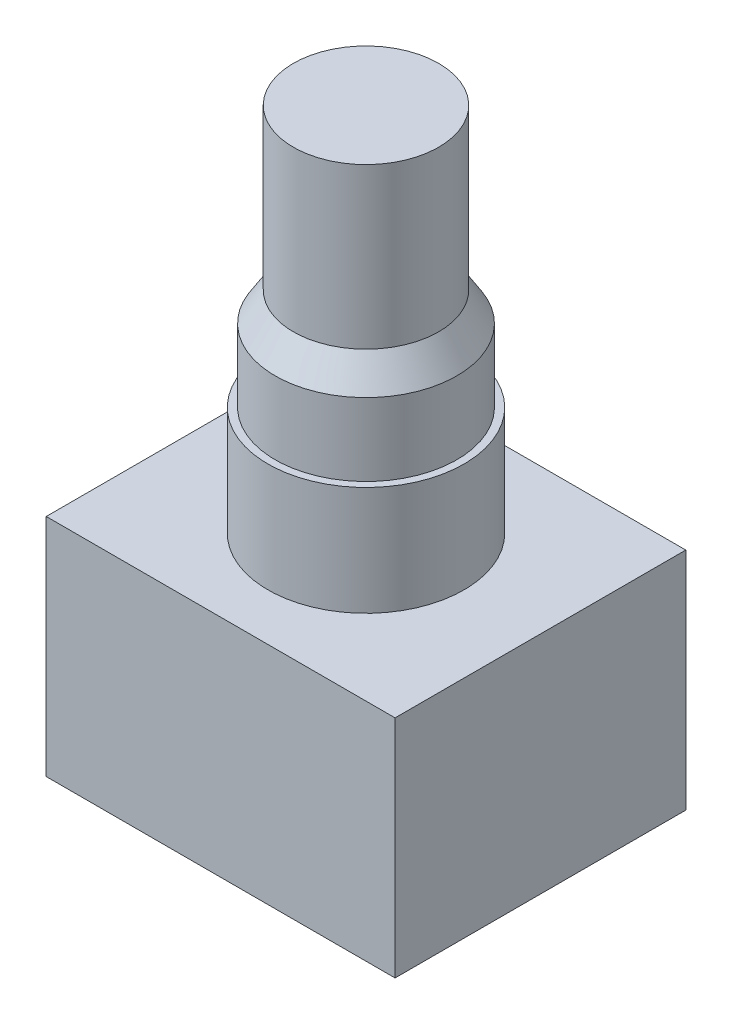
ISO-10303-21;
HEADER;
FILE_DESCRIPTION(('STEP AP214'),'2;1');
FILE_NAME('part.step','',(''),(''),'','','');
FILE_SCHEMA(('AUTOMOTIVE_DESIGN { 1 0 10303 214 1 1 1 1 }'));
ENDSEC;
DATA;
#1=APPLICATION_CONTEXT('core data for automotive mechanical design processes');
#2=APPLICATION_PROTOCOL_DEFINITION('international standard','automotive_design',2000,#1);
#3=PRODUCT_CONTEXT('',#1,'mechanical');
#4=PRODUCT('Part','Part','',(#3));
#5=PRODUCT_RELATED_PRODUCT_CATEGORY('part','',(#4));
#6=PRODUCT_DEFINITION_FORMATION('','',#4);
#7=PRODUCT_DEFINITION_CONTEXT('part definition',#1,'design');
#8=PRODUCT_DEFINITION('design','',#6,#7);
#9=PRODUCT_DEFINITION_SHAPE('','',#8);
#10=(LENGTH_UNIT() NAMED_UNIT(*) SI_UNIT(.MILLI.,.METRE.));
#11=(NAMED_UNIT(*) PLANE_ANGLE_UNIT() SI_UNIT($,.RADIAN.));
#12=(NAMED_UNIT(*) SI_UNIT($,.STERADIAN.) SOLID_ANGLE_UNIT());
#13=UNCERTAINTY_MEASURE_WITH_UNIT(LENGTH_MEASURE(1.E-05),#10,'distance_accuracy_value','');
#14=(GEOMETRIC_REPRESENTATION_CONTEXT(3) GLOBAL_UNCERTAINTY_ASSIGNED_CONTEXT((#13)) GLOBAL_UNIT_ASSIGNED_CONTEXT((#10,
#11,#12)) REPRESENTATION_CONTEXT('',''));
#15=CARTESIAN_POINT('',(0.,0.,0.));
#16=DIRECTION('',(0.,0.,1.));
#17=DIRECTION('',(1.,0.,0.));
#18=AXIS2_PLACEMENT_3D('',#15,#16,#17);
#19=CARTESIAN_POINT('',(-6.096,-7.874,5.08));
#20=DIRECTION('',(-1.,0.,0.));
#21=DIRECTION('',(0.,0.,1.));
#22=AXIS2_PLACEMENT_3D('',#19,#20,#21);
#23=PLANE('',#22);
#24=DIRECTION('',(0.,0.,1.));
#25=VECTOR('',#24,1.);
#26=CARTESIAN_POINT('',(-6.096,0.,5.08));
#27=LINE('',#26,#25);
#28=CARTESIAN_POINT('',(-6.096,0.,-5.08));
#29=VERTEX_POINT('',#28);
#30=CARTESIAN_POINT('',(-6.096,0.,5.08));
#31=VERTEX_POINT('',#30);
#32=EDGE_CURVE('E112',#29,#31,#27,.T.);
#33=ORIENTED_EDGE('',*,*,#32,.F.);
#34=DIRECTION('',(0.,1.,0.));
#35=VECTOR('',#34,1.);
#36=CARTESIAN_POINT('',(-6.096,-7.874,-5.08));
#37=LINE('',#36,#35);
#38=CARTESIAN_POINT('',(-6.096,-7.874,-5.08));
#39=VERTEX_POINT('',#38);
#40=EDGE_CURVE('E11',#39,#29,#37,.T.);
#41=ORIENTED_EDGE('',*,*,#40,.F.);
#42=DIRECTION('',(0.,0.,1.));
#43=VECTOR('',#42,1.);
#44=CARTESIAN_POINT('',(-6.096,-7.874,5.08));
#45=LINE('',#44,#43);
#46=CARTESIAN_POINT('',(-6.096,-7.874,5.08));
#47=VERTEX_POINT('',#46);
#48=EDGE_CURVE('E103',#39,#47,#45,.T.);
#49=ORIENTED_EDGE('',*,*,#48,.T.);
#50=DIRECTION('',(0.,1.,0.));
#51=VECTOR('',#50,1.);
#52=CARTESIAN_POINT('',(-6.096,-7.874,5.08));
#53=LINE('',#52,#51);
#54=EDGE_CURVE('E44',#47,#31,#53,.T.);
#55=ORIENTED_EDGE('',*,*,#54,.T.);
#56=EDGE_LOOP('',(#33,#41,#49,#55));
#57=FACE_BOUND('',#56,.T.);
#58=ADVANCED_FACE('F41',(#57),#23,.T.);
#59=CARTESIAN_POINT('',(6.096,-7.874,-5.08));
#60=DIRECTION('',(0.,0.,-1.));
#61=DIRECTION('',(-1.,0.,0.));
#62=AXIS2_PLACEMENT_3D('',#59,#60,#61);
#63=PLANE('',#62);
#64=DIRECTION('',(-1.,0.,0.));
#65=VECTOR('',#64,1.);
#66=CARTESIAN_POINT('',(6.096,0.,-5.08));
#67=LINE('',#66,#65);
#68=CARTESIAN_POINT('',(6.096,0.,-5.08));
#69=VERTEX_POINT('',#68);
#70=EDGE_CURVE('E106',#69,#29,#67,.T.);
#71=ORIENTED_EDGE('',*,*,#70,.F.);
#72=DIRECTION('',(0.,1.,0.));
#73=VECTOR('',#72,1.);
#74=CARTESIAN_POINT('',(6.096,-7.874,-5.08));
#75=LINE('',#74,#73);
#76=CARTESIAN_POINT('',(6.096,-7.874,-5.08));
#77=VERTEX_POINT('',#76);
#78=EDGE_CURVE('E51',#77,#69,#75,.T.);
#79=ORIENTED_EDGE('',*,*,#78,.F.);
#80=DIRECTION('',(-1.,0.,0.));
#81=VECTOR('',#80,1.);
#82=CARTESIAN_POINT('',(6.096,-7.874,-5.08));
#83=LINE('',#82,#81);
#84=EDGE_CURVE('E98',#77,#39,#83,.T.);
#85=ORIENTED_EDGE('',*,*,#84,.T.);
#86=ORIENTED_EDGE('',*,*,#40,.T.);
#87=EDGE_LOOP('',(#71,#79,#85,#86));
#88=FACE_BOUND('',#87,.T.);
#89=ADVANCED_FACE('F129',(#88),#63,.T.);
#90=CARTESIAN_POINT('',(6.096,-7.874,5.08));
#91=DIRECTION('',(1.,0.,0.));
#92=DIRECTION('',(0.,0.,-1.));
#93=AXIS2_PLACEMENT_3D('',#90,#91,#92);
#94=PLANE('',#93);
#95=DIRECTION('',(0.,0.,-1.));
#96=VECTOR('',#95,1.);
#97=CARTESIAN_POINT('',(6.096,0.,5.08));
#98=LINE('',#97,#96);
#99=CARTESIAN_POINT('',(6.096,0.,5.08));
#100=VERTEX_POINT('',#99);
#101=EDGE_CURVE('E92',#100,#69,#98,.T.);
#102=ORIENTED_EDGE('',*,*,#101,.F.);
#103=DIRECTION('',(0.,1.,0.));
#104=VECTOR('',#103,1.);
#105=CARTESIAN_POINT('',(6.096,-7.874,5.08));
#106=LINE('',#105,#104);
#107=CARTESIAN_POINT('',(6.096,-7.874,5.08));
#108=VERTEX_POINT('',#107);
#109=EDGE_CURVE('E87',#108,#100,#106,.T.);
#110=ORIENTED_EDGE('',*,*,#109,.F.);
#111=DIRECTION('',(0.,0.,-1.));
#112=VECTOR('',#111,1.);
#113=CARTESIAN_POINT('',(6.096,-7.874,5.08));
#114=LINE('',#113,#112);
#115=EDGE_CURVE('E90',#108,#77,#114,.T.);
#116=ORIENTED_EDGE('',*,*,#115,.T.);
#117=ORIENTED_EDGE('',*,*,#78,.T.);
#118=EDGE_LOOP('',(#102,#110,#116,#117));
#119=FACE_BOUND('',#118,.T.);
#120=ADVANCED_FACE('F89',(#119),#94,.T.);
#121=CARTESIAN_POINT('',(6.096,-7.874,5.08));
#122=DIRECTION('',(0.,0.,1.));
#123=DIRECTION('',(1.,0.,0.));
#124=AXIS2_PLACEMENT_3D('',#121,#122,#123);
#125=PLANE('',#124);
#126=DIRECTION('',(1.,0.,0.));
#127=VECTOR('',#126,1.);
#128=CARTESIAN_POINT('',(6.096,0.,5.08));
#129=LINE('',#128,#127);
#130=EDGE_CURVE('E116',#31,#100,#129,.T.);
#131=ORIENTED_EDGE('',*,*,#130,.F.);
#132=ORIENTED_EDGE('',*,*,#54,.F.);
#133=DIRECTION('',(1.,0.,0.));
#134=VECTOR('',#133,1.);
#135=CARTESIAN_POINT('',(6.096,-7.874,5.08));
#136=LINE('',#135,#134);
#137=EDGE_CURVE('E97',#47,#108,#136,.T.);
#138=ORIENTED_EDGE('',*,*,#137,.T.);
#139=ORIENTED_EDGE('',*,*,#109,.T.);
#140=EDGE_LOOP('',(#131,#132,#138,#139));
#141=FACE_BOUND('',#140,.T.);
#142=ADVANCED_FACE('F101',(#141),#125,.T.);
#143=CARTESIAN_POINT('',(0.,-7.874,0.));
#144=DIRECTION('',(0.,1.,0.));
#145=DIRECTION('',(0.,0.,1.));
#146=AXIS2_PLACEMENT_3D('',#143,#144,#145);
#147=PLANE('',#146);
#148=ORIENTED_EDGE('',*,*,#48,.F.);
#149=ORIENTED_EDGE('',*,*,#84,.F.);
#150=ORIENTED_EDGE('',*,*,#115,.F.);
#151=ORIENTED_EDGE('',*,*,#137,.F.);
#152=EDGE_LOOP('',(#148,#149,#150,#151));
#153=FACE_BOUND('',#152,.T.);
#154=ADVANCED_FACE('F96',(#153),#147,.F.);
#155=CARTESIAN_POINT('',(0.,0.,0.));
#156=DIRECTION('',(0.,1.,0.));
#157=DIRECTION('',(0.,0.,1.));
#158=AXIS2_PLACEMENT_3D('',#155,#156,#157);
#159=PLANE('',#158);
#160=CARTESIAN_POINT('',(0.,0.,0.));
#161=DIRECTION('',(0.,-1.,0.));
#162=DIRECTION('',(0.,0.,-1.));
#163=AXIS2_PLACEMENT_3D('',#160,#161,#162);
#164=CIRCLE('',#163,3.429);
#165=CARTESIAN_POINT('',(0.,0.,-3.429));
#166=VERTEX_POINT('',#165);
#167=EDGE_CURVE('E117',#166,#166,#164,.T.);
#168=ORIENTED_EDGE('',*,*,#167,.T.);
#169=EDGE_LOOP('',(#168));
#170=FACE_BOUND('',#169,.T.);
#171=ORIENTED_EDGE('',*,*,#32,.T.);
#172=ORIENTED_EDGE('',*,*,#130,.T.);
#173=ORIENTED_EDGE('',*,*,#101,.T.);
#174=ORIENTED_EDGE('',*,*,#70,.T.);
#175=EDGE_LOOP('',(#171,#172,#173,#174));
#176=FACE_BOUND('',#175,.T.);
#177=ADVANCED_FACE('F128',(#170,#176),#159,.T.);
#178=CARTESIAN_POINT('',(0.,0.,0.));
#179=DIRECTION('',(0.,-1.,0.));
#180=DIRECTION('',(0.,0.,-1.));
#181=AXIS2_PLACEMENT_3D('',#178,#179,#180);
#182=CYLINDRICAL_SURFACE('',#181,3.429);
#183=CARTESIAN_POINT('',(0.,3.81,0.));
#184=DIRECTION('',(0.,-1.,0.));
#185=DIRECTION('',(0.,0.,-1.));
#186=AXIS2_PLACEMENT_3D('',#183,#184,#185);
#187=CIRCLE('',#186,3.429);
#188=CARTESIAN_POINT('',(0.,3.81,-3.429));
#189=VERTEX_POINT('',#188);
#190=EDGE_CURVE('E191',#189,#189,#187,.T.);
#191=ORIENTED_EDGE('',*,*,#190,.T.);
#192=EDGE_LOOP('',(#191));
#193=FACE_BOUND('',#192,.T.);
#194=ORIENTED_EDGE('',*,*,#167,.F.);
#195=EDGE_LOOP('',(#194));
#196=FACE_BOUND('',#195,.T.);
#197=ADVANCED_FACE('F146',(#193,#196),#182,.T.);
#198=CARTESIAN_POINT('',(0.,3.81,-3.429));
#199=DIRECTION('',(0.,1.,0.));
#200=DIRECTION('',(0.,0.,1.));
#201=AXIS2_PLACEMENT_3D('',#198,#199,#200);
#202=PLANE('',#201);
#203=CARTESIAN_POINT('',(0.,3.81,0.));
#204=DIRECTION('',(0.,-1.,0.));
#205=DIRECTION('',(0.,0.,-1.));
#206=AXIS2_PLACEMENT_3D('',#203,#204,#205);
#207=CIRCLE('',#206,3.175);
#208=CARTESIAN_POINT('',(0.,3.81,-3.175));
#209=VERTEX_POINT('',#208);
#210=EDGE_CURVE('E187',#209,#209,#207,.T.);
#211=ORIENTED_EDGE('',*,*,#210,.T.);
#212=EDGE_LOOP('',(#211));
#213=FACE_BOUND('',#212,.T.);
#214=ORIENTED_EDGE('',*,*,#190,.F.);
#215=EDGE_LOOP('',(#214));
#216=FACE_BOUND('',#215,.T.);
#217=ADVANCED_FACE('F151',(#213,#216),#202,.T.);
#218=CARTESIAN_POINT('',(0.,0.,0.));
#219=DIRECTION('',(0.,-1.,0.));
#220=DIRECTION('',(0.,0.,-1.));
#221=AXIS2_PLACEMENT_3D('',#218,#219,#220);
#222=CYLINDRICAL_SURFACE('',#221,3.175);
#223=CARTESIAN_POINT('',(0.,6.35,0.));
#224=DIRECTION('',(0.,-1.,0.));
#225=DIRECTION('',(0.,0.,-1.));
#226=AXIS2_PLACEMENT_3D('',#223,#224,#225);
#227=CIRCLE('',#226,3.175);
#228=CARTESIAN_POINT('',(0.,6.35,-3.175));
#229=VERTEX_POINT('',#228);
#230=EDGE_CURVE('E181',#229,#229,#227,.T.);
#231=ORIENTED_EDGE('',*,*,#230,.T.);
#232=EDGE_LOOP('',(#231));
#233=FACE_BOUND('',#232,.T.);
#234=ORIENTED_EDGE('',*,*,#210,.F.);
#235=EDGE_LOOP('',(#234));
#236=FACE_BOUND('',#235,.T.);
#237=ADVANCED_FACE('F155',(#233,#236),#222,.T.);
#238=CARTESIAN_POINT('',(0.,6.35,0.));
#239=DIRECTION('',(0.,-1.,0.));
#240=DIRECTION('',(0.,0.,-1.));
#241=AXIS2_PLACEMENT_3D('',#238,#239,#240);
#242=CONICAL_SURFACE('',#241,3.175,0.558599315343562);
#243=CARTESIAN_POINT('',(0.,7.366,0.));
#244=DIRECTION('',(0.,-1.,0.));
#245=DIRECTION('',(0.,0.,-1.));
#246=AXIS2_PLACEMENT_3D('',#243,#244,#245);
#247=CIRCLE('',#246,2.54);
#248=CARTESIAN_POINT('',(0.,7.366,-2.54));
#249=VERTEX_POINT('',#248);
#250=EDGE_CURVE('E177',#249,#249,#247,.T.);
#251=ORIENTED_EDGE('',*,*,#250,.T.);
#252=EDGE_LOOP('',(#251));
#253=FACE_BOUND('',#252,.T.);
#254=ORIENTED_EDGE('',*,*,#230,.F.);
#255=EDGE_LOOP('',(#254));
#256=FACE_BOUND('',#255,.T.);
#257=ADVANCED_FACE('F159',(#253,#256),#242,.T.);
#258=CARTESIAN_POINT('',(0.,0.,0.));
#259=DIRECTION('',(0.,-1.,0.));
#260=DIRECTION('',(0.,0.,-1.));
#261=AXIS2_PLACEMENT_3D('',#258,#259,#260);
#262=CYLINDRICAL_SURFACE('',#261,2.54);
#263=CARTESIAN_POINT('',(0.,12.954,0.));
#264=DIRECTION('',(0.,-1.,0.));
#265=DIRECTION('',(0.,0.,-1.));
#266=AXIS2_PLACEMENT_3D('',#263,#264,#265);
#267=CIRCLE('',#266,2.54);
#268=CARTESIAN_POINT('',(0.,12.954,-2.54));
#269=VERTEX_POINT('',#268);
#270=EDGE_CURVE('E175',#269,#269,#267,.T.);
#271=ORIENTED_EDGE('',*,*,#270,.T.);
#272=EDGE_LOOP('',(#271));
#273=FACE_BOUND('',#272,.T.);
#274=ORIENTED_EDGE('',*,*,#250,.F.);
#275=EDGE_LOOP('',(#274));
#276=FACE_BOUND('',#275,.T.);
#277=ADVANCED_FACE('F163',(#273,#276),#262,.T.);
#278=CARTESIAN_POINT('',(0.,12.954,-2.54));
#279=DIRECTION('',(0.,1.,0.));
#280=DIRECTION('',(0.,0.,1.));
#281=AXIS2_PLACEMENT_3D('',#278,#279,#280);
#282=PLANE('',#281);
#283=ORIENTED_EDGE('',*,*,#270,.F.);
#284=EDGE_LOOP('',(#283));
#285=FACE_BOUND('',#284,.T.);
#286=ADVANCED_FACE('F167',(#285),#282,.T.);
#287=CLOSED_SHELL('',(#58,#89,#120,#142,#154,#177,#197,#217,#237,#257,#277,#286));
#288=MANIFOLD_SOLID_BREP('B2',#287);
#289=ADVANCED_BREP_SHAPE_REPRESENTATION('',(#18,#288),#14);
#290=SHAPE_DEFINITION_REPRESENTATION(#9,#289);
ENDSEC;
END-ISO-10303-21;
